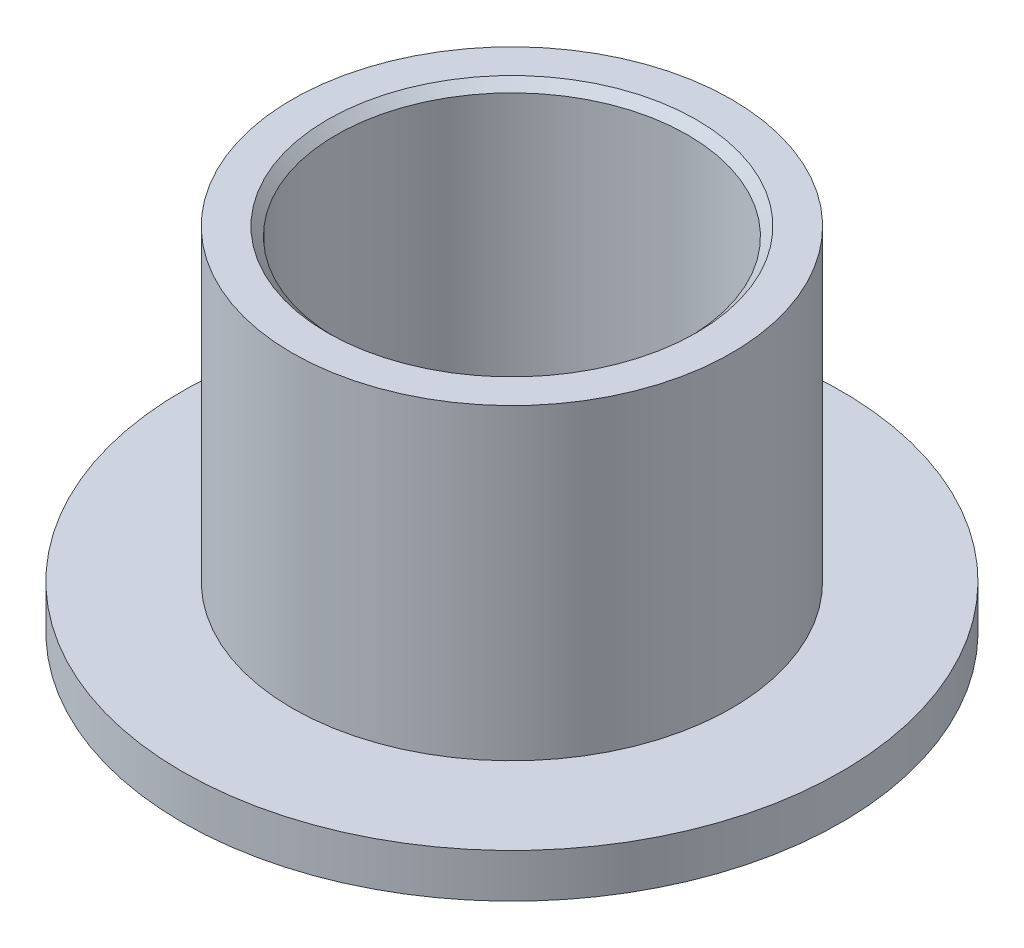
ISO-10303-21;
HEADER;
FILE_DESCRIPTION(('STEP AP214'),'2;1');
FILE_NAME('part.step','',(''),(''),'','','');
FILE_SCHEMA(('AUTOMOTIVE_DESIGN { 1 0 10303 214 1 1 1 1 }'));
ENDSEC;
DATA;
#1=APPLICATION_CONTEXT('core data for automotive mechanical design processes');
#2=APPLICATION_PROTOCOL_DEFINITION('international standard','automotive_design',2000,#1);
#3=PRODUCT_CONTEXT('',#1,'mechanical');
#4=PRODUCT('Part','Part','',(#3));
#5=PRODUCT_RELATED_PRODUCT_CATEGORY('part','',(#4));
#6=PRODUCT_DEFINITION_FORMATION('','',#4);
#7=PRODUCT_DEFINITION_CONTEXT('part definition',#1,'design');
#8=PRODUCT_DEFINITION('design','',#6,#7);
#9=PRODUCT_DEFINITION_SHAPE('','',#8);
#10=(LENGTH_UNIT() NAMED_UNIT(*) SI_UNIT(.MILLI.,.METRE.));
#11=(NAMED_UNIT(*) PLANE_ANGLE_UNIT() SI_UNIT($,.RADIAN.));
#12=(NAMED_UNIT(*) SI_UNIT($,.STERADIAN.) SOLID_ANGLE_UNIT());
#13=UNCERTAINTY_MEASURE_WITH_UNIT(LENGTH_MEASURE(1.E-05),#10,'distance_accuracy_value','');
#14=(GEOMETRIC_REPRESENTATION_CONTEXT(3) GLOBAL_UNCERTAINTY_ASSIGNED_CONTEXT((#13)) GLOBAL_UNIT_ASSIGNED_CONTEXT((#10,
#11,#12)) REPRESENTATION_CONTEXT('',''));
#15=CARTESIAN_POINT('',(0.,0.,0.));
#16=DIRECTION('',(0.,0.,1.));
#17=DIRECTION('',(1.,0.,0.));
#18=AXIS2_PLACEMENT_3D('',#15,#16,#17);
#19=CARTESIAN_POINT('',(0.,1.,0.));
#20=DIRECTION('',(0.,-1.,0.));
#21=DIRECTION('',(0.,0.,-1.));
#22=AXIS2_PLACEMENT_3D('',#19,#20,#21);
#23=CYLINDRICAL_SURFACE('',#22,7.5);
#24=CARTESIAN_POINT('',(0.,1.,0.));
#25=DIRECTION('',(0.,1.,0.));
#26=DIRECTION('',(0.,0.,1.));
#27=AXIS2_PLACEMENT_3D('',#24,#25,#26);
#28=CIRCLE('',#27,7.5);
#29=CARTESIAN_POINT('',(0.,1.,7.5));
#30=VERTEX_POINT('',#29);
#31=EDGE_CURVE('E65',#30,#30,#28,.T.);
#32=ORIENTED_EDGE('',*,*,#31,.F.);
#33=EDGE_LOOP('',(#32));
#34=FACE_BOUND('',#33,.T.);
#35=CARTESIAN_POINT('',(0.,0.,0.));
#36=DIRECTION('',(0.,1.,0.));
#37=DIRECTION('',(0.,0.,1.));
#38=AXIS2_PLACEMENT_3D('',#35,#36,#37);
#39=CIRCLE('',#38,7.5);
#40=CARTESIAN_POINT('',(0.,0.,7.5));
#41=VERTEX_POINT('',#40);
#42=EDGE_CURVE('E62',#41,#41,#39,.T.);
#43=ORIENTED_EDGE('',*,*,#42,.T.);
#44=EDGE_LOOP('',(#43));
#45=FACE_BOUND('',#44,.T.);
#46=ADVANCED_FACE('F41',(#34,#45),#23,.T.);
#47=CARTESIAN_POINT('',(0.,1.,0.));
#48=DIRECTION('',(0.,1.,0.));
#49=DIRECTION('',(0.,0.,1.));
#50=AXIS2_PLACEMENT_3D('',#47,#48,#49);
#51=PLANE('',#50);
#52=CARTESIAN_POINT('',(0.,1.,0.));
#53=DIRECTION('',(0.,1.,0.));
#54=DIRECTION('',(0.,0.,1.));
#55=AXIS2_PLACEMENT_3D('',#52,#53,#54);
#56=CIRCLE('',#55,5.);
#57=CARTESIAN_POINT('',(0.,1.,5.));
#58=VERTEX_POINT('',#57);
#59=EDGE_CURVE('E61',#58,#58,#56,.T.);
#60=ORIENTED_EDGE('',*,*,#59,.F.);
#61=EDGE_LOOP('',(#60));
#62=FACE_BOUND('',#61,.T.);
#63=ORIENTED_EDGE('',*,*,#31,.T.);
#64=EDGE_LOOP('',(#63));
#65=FACE_BOUND('',#64,.T.);
#66=ADVANCED_FACE('F83',(#62,#65),#51,.T.);
#67=CARTESIAN_POINT('',(0.,0.,0.));
#68=DIRECTION('',(0.,1.,0.));
#69=DIRECTION('',(0.,0.,1.));
#70=AXIS2_PLACEMENT_3D('',#67,#68,#69);
#71=PLANE('',#70);
#72=CARTESIAN_POINT('',(0.,0.,0.));
#73=DIRECTION('',(0.,1.,0.));
#74=DIRECTION('',(0.,0.,1.));
#75=AXIS2_PLACEMENT_3D('',#72,#73,#74);
#76=CIRCLE('',#75,4.2);
#77=CARTESIAN_POINT('',(0.,0.,4.2));
#78=VERTEX_POINT('',#77);
#79=EDGE_CURVE('E56',#78,#78,#76,.T.);
#80=ORIENTED_EDGE('',*,*,#79,.T.);
#81=EDGE_LOOP('',(#80));
#82=FACE_BOUND('',#81,.T.);
#83=ORIENTED_EDGE('',*,*,#42,.F.);
#84=EDGE_LOOP('',(#83));
#85=FACE_BOUND('',#84,.T.);
#86=ADVANCED_FACE('F79',(#82,#85),#71,.F.);
#87=CARTESIAN_POINT('',(0.,8.,0.));
#88=DIRECTION('',(0.,-1.,0.));
#89=DIRECTION('',(0.,0.,-1.));
#90=AXIS2_PLACEMENT_3D('',#87,#88,#89);
#91=CYLINDRICAL_SURFACE('',#90,5.);
#92=CARTESIAN_POINT('',(0.,8.,0.));
#93=DIRECTION('',(0.,1.,0.));
#94=DIRECTION('',(0.,0.,1.));
#95=AXIS2_PLACEMENT_3D('',#92,#93,#94);
#96=CIRCLE('',#95,5.);
#97=CARTESIAN_POINT('',(0.,8.,5.));
#98=VERTEX_POINT('',#97);
#99=EDGE_CURVE('E66',#98,#98,#96,.T.);
#100=ORIENTED_EDGE('',*,*,#99,.F.);
#101=EDGE_LOOP('',(#100));
#102=FACE_BOUND('',#101,.T.);
#103=ORIENTED_EDGE('',*,*,#59,.T.);
#104=EDGE_LOOP('',(#103));
#105=FACE_BOUND('',#104,.T.);
#106=ADVANCED_FACE('F76',(#102,#105),#91,.T.);
#107=CARTESIAN_POINT('',(0.,8.,0.));
#108=DIRECTION('',(0.,1.,0.));
#109=DIRECTION('',(0.,0.,1.));
#110=AXIS2_PLACEMENT_3D('',#107,#108,#109);
#111=PLANE('',#110);
#112=CARTESIAN_POINT('',(0.,8.,0.));
#113=DIRECTION('',(0.,1.,0.));
#114=DIRECTION('',(0.,0.,1.));
#115=AXIS2_PLACEMENT_3D('',#112,#113,#114);
#116=CIRCLE('',#115,4.2);
#117=CARTESIAN_POINT('',(0.,8.,4.2));
#118=VERTEX_POINT('',#117);
#119=EDGE_CURVE('E10',#118,#118,#116,.F.);
#120=ORIENTED_EDGE('',*,*,#119,.T.);
#121=EDGE_LOOP('',(#120));
#122=FACE_BOUND('',#121,.T.);
#123=ORIENTED_EDGE('',*,*,#99,.T.);
#124=EDGE_LOOP('',(#123));
#125=FACE_BOUND('',#124,.T.);
#126=ADVANCED_FACE('F74',(#122,#125),#111,.T.);
#127=CARTESIAN_POINT('',(0.,0.,0.));
#128=DIRECTION('',(0.,1.,0.));
#129=DIRECTION('',(0.,0.,1.));
#130=AXIS2_PLACEMENT_3D('',#127,#128,#129);
#131=CYLINDRICAL_SURFACE('',#130,4.);
#132=CARTESIAN_POINT('',(0.,0.200000000000001,0.));
#133=DIRECTION('',(0.,1.,0.));
#134=DIRECTION('',(0.,0.,1.));
#135=AXIS2_PLACEMENT_3D('',#132,#133,#134);
#136=CIRCLE('',#135,4.);
#137=CARTESIAN_POINT('',(0.,0.200000000000001,4.));
#138=VERTEX_POINT('',#137);
#139=EDGE_CURVE('E48',#138,#138,#136,.F.);
#140=ORIENTED_EDGE('',*,*,#139,.T.);
#141=EDGE_LOOP('',(#140));
#142=FACE_BOUND('',#141,.T.);
#143=CARTESIAN_POINT('',(0.,7.8,0.));
#144=DIRECTION('',(0.,1.,0.));
#145=DIRECTION('',(0.,0.,1.));
#146=AXIS2_PLACEMENT_3D('',#143,#144,#145);
#147=CIRCLE('',#146,4.);
#148=CARTESIAN_POINT('',(0.,7.8,4.));
#149=VERTEX_POINT('',#148);
#150=EDGE_CURVE('E52',#149,#149,#147,.T.);
#151=ORIENTED_EDGE('',*,*,#150,.T.);
#152=EDGE_LOOP('',(#151));
#153=FACE_BOUND('',#152,.T.);
#154=ADVANCED_FACE('F102',(#142,#153),#131,.F.);
#155=CARTESIAN_POINT('',(0.,0.,0.));
#156=DIRECTION('',(0.,-1.,0.));
#157=DIRECTION('',(0.,0.,-1.));
#158=AXIS2_PLACEMENT_3D('',#155,#156,#157);
#159=CONICAL_SURFACE('',#158,4.2,0.785398163397444);
#160=ORIENTED_EDGE('',*,*,#139,.F.);
#161=EDGE_LOOP('',(#160));
#162=FACE_BOUND('',#161,.T.);
#163=ORIENTED_EDGE('',*,*,#79,.F.);
#164=EDGE_LOOP('',(#163));
#165=FACE_BOUND('',#164,.T.);
#166=ADVANCED_FACE('F100',(#162,#165),#159,.F.);
#167=CARTESIAN_POINT('',(0.,7.8,0.));
#168=DIRECTION('',(0.,1.,0.));
#169=DIRECTION('',(0.,0.,1.));
#170=AXIS2_PLACEMENT_3D('',#167,#168,#169);
#171=CONICAL_SURFACE('',#170,4.,0.785398163397448);
#172=ORIENTED_EDGE('',*,*,#119,.F.);
#173=EDGE_LOOP('',(#172));
#174=FACE_BOUND('',#173,.T.);
#175=ORIENTED_EDGE('',*,*,#150,.F.);
#176=EDGE_LOOP('',(#175));
#177=FACE_BOUND('',#176,.T.);
#178=ADVANCED_FACE('F43',(#174,#177),#171,.F.);
#179=CLOSED_SHELL('',(#46,#66,#86,#106,#126,#154,#166,#178));
#180=MANIFOLD_SOLID_BREP('B2',#179);
#181=ADVANCED_BREP_SHAPE_REPRESENTATION('',(#18,#180),#14);
#182=SHAPE_DEFINITION_REPRESENTATION(#9,#181);
ENDSEC;
END-ISO-10303-21;
